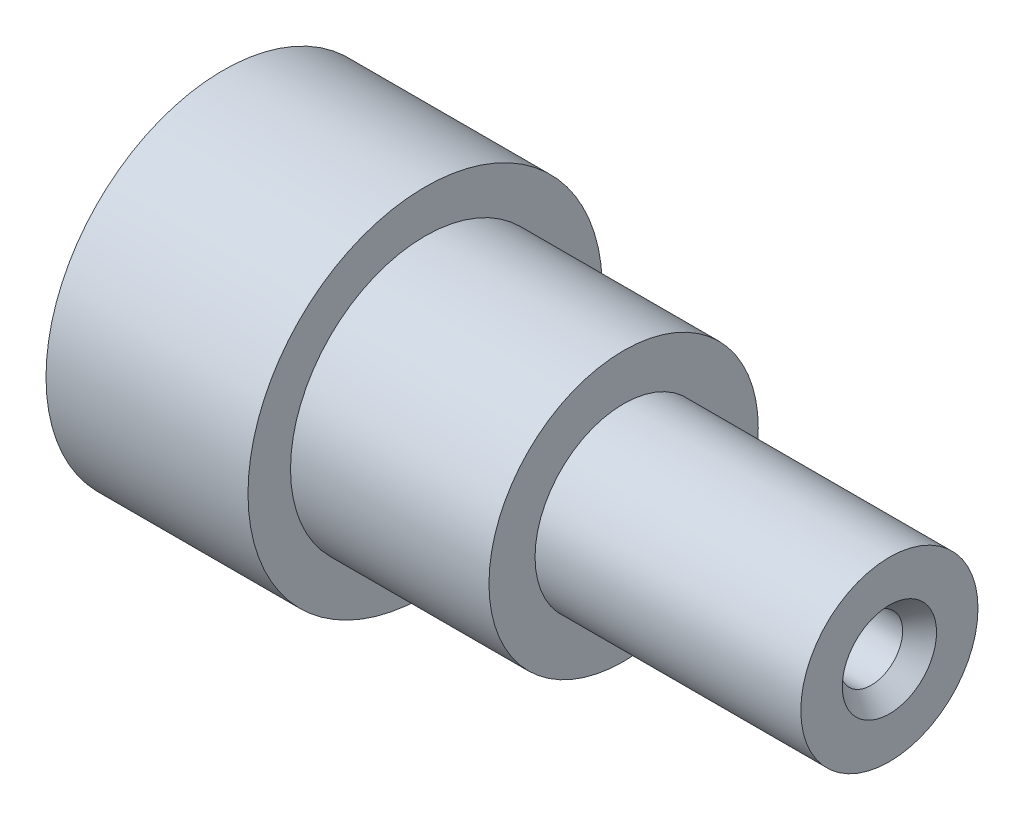
ISO-10303-21;
HEADER;
FILE_DESCRIPTION(('STEP AP214'),'2;1');
FILE_NAME('part.step','',(''),(''),'','','');
FILE_SCHEMA(('AUTOMOTIVE_DESIGN { 1 0 10303 214 1 1 1 1 }'));
ENDSEC;
DATA;
#1=APPLICATION_CONTEXT('core data for automotive mechanical design processes');
#2=APPLICATION_PROTOCOL_DEFINITION('international standard','automotive_design',2000,#1);
#3=PRODUCT_CONTEXT('',#1,'mechanical');
#4=PRODUCT('Part','Part','',(#3));
#5=PRODUCT_RELATED_PRODUCT_CATEGORY('part','',(#4));
#6=PRODUCT_DEFINITION_FORMATION('','',#4);
#7=PRODUCT_DEFINITION_CONTEXT('part definition',#1,'design');
#8=PRODUCT_DEFINITION('design','',#6,#7);
#9=PRODUCT_DEFINITION_SHAPE('','',#8);
#10=(LENGTH_UNIT() NAMED_UNIT(*) SI_UNIT(.MILLI.,.METRE.));
#11=(NAMED_UNIT(*) PLANE_ANGLE_UNIT() SI_UNIT($,.RADIAN.));
#12=(NAMED_UNIT(*) SI_UNIT($,.STERADIAN.) SOLID_ANGLE_UNIT());
#13=UNCERTAINTY_MEASURE_WITH_UNIT(LENGTH_MEASURE(1.E-05),#10,'distance_accuracy_value','');
#14=(GEOMETRIC_REPRESENTATION_CONTEXT(3) GLOBAL_UNCERTAINTY_ASSIGNED_CONTEXT((#13)) GLOBAL_UNIT_ASSIGNED_CONTEXT((#10,
#11,#12)) REPRESENTATION_CONTEXT('',''));
#15=CARTESIAN_POINT('',(0.,0.,0.));
#16=DIRECTION('',(0.,0.,1.));
#17=DIRECTION('',(1.,0.,0.));
#18=AXIS2_PLACEMENT_3D('',#15,#16,#17);
#19=CARTESIAN_POINT('',(-22.6005248359888,0.,-12.7));
#20=DIRECTION('',(1.,0.,0.));
#21=DIRECTION('',(0.,0.,-1.));
#22=AXIS2_PLACEMENT_3D('',#19,#20,#21);
#23=PLANE('',#22);
#24=CARTESIAN_POINT('',(-22.6005248359888,0.,0.));
#25=DIRECTION('',(-1.,0.,0.));
#26=DIRECTION('',(0.,0.,1.));
#27=AXIS2_PLACEMENT_3D('',#24,#25,#26);
#28=CIRCLE('',#27,12.7);
#29=CARTESIAN_POINT('',(-22.6005248359888,0.,12.7));
#30=VERTEX_POINT('',#29);
#31=EDGE_CURVE('E69',#30,#30,#28,.T.);
#32=ORIENTED_EDGE('',*,*,#31,.T.);
#33=EDGE_LOOP('',(#32));
#34=FACE_BOUND('',#33,.T.);
#35=ADVANCED_FACE('F47',(#34),#23,.F.);
#36=CARTESIAN_POINT('',(25.1514751640112,0.,0.));
#37=DIRECTION('',(-1.,0.,0.));
#38=DIRECTION('',(0.,0.,1.));
#39=AXIS2_PLACEMENT_3D('',#36,#37,#38);
#40=PLANE('',#39);
#41=CARTESIAN_POINT('',(25.1514751640112,0.,0.));
#42=DIRECTION('',(1.,0.,0.));
#43=DIRECTION('',(0.,0.,-1.));
#44=AXIS2_PLACEMENT_3D('',#41,#42,#43);
#45=CIRCLE('',#44,3.3782);
#46=CARTESIAN_POINT('',(25.1514751640112,0.,-3.3782));
#47=VERTEX_POINT('',#46);
#48=EDGE_CURVE('E78',#47,#47,#45,.T.);
#49=ORIENTED_EDGE('',*,*,#48,.F.);
#50=EDGE_LOOP('',(#49));
#51=FACE_BOUND('',#50,.T.);
#52=CARTESIAN_POINT('',(25.1514751640112,0.,0.));
#53=DIRECTION('',(-1.,0.,0.));
#54=DIRECTION('',(0.,0.,1.));
#55=AXIS2_PLACEMENT_3D('',#52,#53,#54);
#56=CIRCLE('',#55,6.35);
#57=CARTESIAN_POINT('',(25.1514751640112,0.,6.35));
#58=VERTEX_POINT('',#57);
#59=EDGE_CURVE('E11',#58,#58,#56,.T.);
#60=ORIENTED_EDGE('',*,*,#59,.F.);
#61=EDGE_LOOP('',(#60));
#62=FACE_BOUND('',#61,.T.);
#63=ADVANCED_FACE('F105',(#51,#62),#40,.F.);
#64=CARTESIAN_POINT('',(-22.6005248359888,0.,0.));
#65=DIRECTION('',(-1.,0.,0.));
#66=DIRECTION('',(0.,0.,1.));
#67=AXIS2_PLACEMENT_3D('',#64,#65,#66);
#68=CYLINDRICAL_SURFACE('',#67,6.35);
#69=CARTESIAN_POINT('',(6.10147516401124,0.,0.));
#70=DIRECTION('',(-1.,0.,0.));
#71=DIRECTION('',(0.,0.,1.));
#72=AXIS2_PLACEMENT_3D('',#69,#70,#71);
#73=CIRCLE('',#72,6.35);
#74=CARTESIAN_POINT('',(6.10147516401124,0.,6.35));
#75=VERTEX_POINT('',#74);
#76=EDGE_CURVE('E57',#75,#75,#73,.T.);
#77=ORIENTED_EDGE('',*,*,#76,.F.);
#78=EDGE_LOOP('',(#77));
#79=FACE_BOUND('',#78,.T.);
#80=ORIENTED_EDGE('',*,*,#59,.T.);
#81=EDGE_LOOP('',(#80));
#82=FACE_BOUND('',#81,.T.);
#83=ADVANCED_FACE('F97',(#79,#82),#68,.T.);
#84=CARTESIAN_POINT('',(6.10147516401124,0.,-6.35));
#85=DIRECTION('',(-1.,0.,0.));
#86=DIRECTION('',(0.,0.,1.));
#87=AXIS2_PLACEMENT_3D('',#84,#85,#86);
#88=PLANE('',#87);
#89=CARTESIAN_POINT('',(6.10147516401124,0.,0.));
#90=DIRECTION('',(-1.,0.,0.));
#91=DIRECTION('',(0.,0.,1.));
#92=AXIS2_PLACEMENT_3D('',#89,#90,#91);
#93=CIRCLE('',#92,9.652);
#94=CARTESIAN_POINT('',(6.10147516401124,0.,9.652));
#95=VERTEX_POINT('',#94);
#96=EDGE_CURVE('E89',#95,#95,#93,.T.);
#97=ORIENTED_EDGE('',*,*,#96,.F.);
#98=EDGE_LOOP('',(#97));
#99=FACE_BOUND('',#98,.T.);
#100=ORIENTED_EDGE('',*,*,#76,.T.);
#101=EDGE_LOOP('',(#100));
#102=FACE_BOUND('',#101,.T.);
#103=ADVANCED_FACE('F100',(#99,#102),#88,.F.);
#104=CARTESIAN_POINT('',(-22.6005248359888,0.,0.));
#105=DIRECTION('',(-1.,0.,0.));
#106=DIRECTION('',(0.,0.,1.));
#107=AXIS2_PLACEMENT_3D('',#104,#105,#106);
#108=CYLINDRICAL_SURFACE('',#107,9.652);
#109=CARTESIAN_POINT('',(-8.12252483598875,0.,0.));
#110=DIRECTION('',(-1.,0.,0.));
#111=DIRECTION('',(0.,0.,1.));
#112=AXIS2_PLACEMENT_3D('',#109,#110,#111);
#113=CIRCLE('',#112,9.652);
#114=CARTESIAN_POINT('',(-8.12252483598875,0.,9.652));
#115=VERTEX_POINT('',#114);
#116=EDGE_CURVE('E88',#115,#115,#113,.T.);
#117=ORIENTED_EDGE('',*,*,#116,.F.);
#118=EDGE_LOOP('',(#117));
#119=FACE_BOUND('',#118,.T.);
#120=ORIENTED_EDGE('',*,*,#96,.T.);
#121=EDGE_LOOP('',(#120));
#122=FACE_BOUND('',#121,.T.);
#123=ADVANCED_FACE('F120',(#119,#122),#108,.T.);
#124=CARTESIAN_POINT('',(-8.12252483598875,0.,-9.652));
#125=DIRECTION('',(-1.,0.,0.));
#126=DIRECTION('',(0.,0.,1.));
#127=AXIS2_PLACEMENT_3D('',#124,#125,#126);
#128=PLANE('',#127);
#129=CARTESIAN_POINT('',(-8.12252483598875,0.,0.));
#130=DIRECTION('',(-1.,0.,0.));
#131=DIRECTION('',(0.,0.,1.));
#132=AXIS2_PLACEMENT_3D('',#129,#130,#131);
#133=CIRCLE('',#132,12.7);
#134=CARTESIAN_POINT('',(-8.12252483598875,0.,12.7));
#135=VERTEX_POINT('',#134);
#136=EDGE_CURVE('E76',#135,#135,#133,.T.);
#137=ORIENTED_EDGE('',*,*,#136,.F.);
#138=EDGE_LOOP('',(#137));
#139=FACE_BOUND('',#138,.T.);
#140=ORIENTED_EDGE('',*,*,#116,.T.);
#141=EDGE_LOOP('',(#140));
#142=FACE_BOUND('',#141,.T.);
#143=ADVANCED_FACE('F121',(#139,#142),#128,.F.);
#144=CARTESIAN_POINT('',(-22.6005248359888,0.,0.));
#145=DIRECTION('',(-1.,0.,0.));
#146=DIRECTION('',(0.,0.,1.));
#147=AXIS2_PLACEMENT_3D('',#144,#145,#146);
#148=CYLINDRICAL_SURFACE('',#147,12.7);
#149=ORIENTED_EDGE('',*,*,#31,.F.);
#150=EDGE_LOOP('',(#149));
#151=FACE_BOUND('',#150,.T.);
#152=ORIENTED_EDGE('',*,*,#136,.T.);
#153=EDGE_LOOP('',(#152));
#154=FACE_BOUND('',#153,.T.);
#155=ADVANCED_FACE('F62',(#151,#154),#148,.T.);
#156=CARTESIAN_POINT('',(6.10147516401125,0.,0.));
#157=DIRECTION('',(1.,0.,0.));
#158=DIRECTION('',(0.,0.,-1.));
#159=AXIS2_PLACEMENT_3D('',#156,#157,#158);
#160=CONICAL_SURFACE('',#159,2.2479,1.02974425867665);
#161=CARTESIAN_POINT('',(4.75080057849919,0.,0.));
#162=VERTEX_POINT('',#161);
#163=VERTEX_LOOP('',#162);
#164=FACE_BOUND('',#163,.T.);
#165=CARTESIAN_POINT('',(6.10147516401125,0.,0.));
#166=DIRECTION('',(1.,0.,0.));
#167=DIRECTION('',(0.,0.,-1.));
#168=AXIS2_PLACEMENT_3D('',#165,#166,#167);
#169=CIRCLE('',#168,2.2479);
#170=CARTESIAN_POINT('',(6.10147516401125,0.,-2.2479));
#171=VERTEX_POINT('',#170);
#172=EDGE_CURVE('E70',#171,#171,#169,.T.);
#173=ORIENTED_EDGE('',*,*,#172,.T.);
#174=EDGE_LOOP('',(#173));
#175=FACE_BOUND('',#174,.T.);
#176=ADVANCED_FACE('F56',(#164,#175),#160,.F.);
#177=CARTESIAN_POINT('',(25.1514751640112,0.,0.));
#178=DIRECTION('',(1.,0.,0.));
#179=DIRECTION('',(0.,0.,-1.));
#180=AXIS2_PLACEMENT_3D('',#177,#178,#179);
#181=CYLINDRICAL_SURFACE('',#180,2.2479);
#182=ORIENTED_EDGE('',*,*,#172,.F.);
#183=EDGE_LOOP('',(#182));
#184=FACE_BOUND('',#183,.T.);
#185=CARTESIAN_POINT('',(23.8512137533293,0.,0.));
#186=DIRECTION('',(1.,0.,0.));
#187=DIRECTION('',(0.,0.,-1.));
#188=AXIS2_PLACEMENT_3D('',#185,#186,#187);
#189=CIRCLE('',#188,2.2479);
#190=CARTESIAN_POINT('',(23.8512137533293,0.,-2.2479));
#191=VERTEX_POINT('',#190);
#192=EDGE_CURVE('E72',#191,#191,#189,.T.);
#193=ORIENTED_EDGE('',*,*,#192,.T.);
#194=EDGE_LOOP('',(#193));
#195=FACE_BOUND('',#194,.T.);
#196=ADVANCED_FACE('F65',(#184,#195),#181,.F.);
#197=CARTESIAN_POINT('',(25.1514751640112,0.,0.));
#198=DIRECTION('',(1.,0.,0.));
#199=DIRECTION('',(0.,0.,-1.));
#200=AXIS2_PLACEMENT_3D('',#197,#198,#199);
#201=CONICAL_SURFACE('',#200,3.3782,0.715584993317675);
#202=ORIENTED_EDGE('',*,*,#192,.F.);
#203=EDGE_LOOP('',(#202));
#204=FACE_BOUND('',#203,.T.);
#205=ORIENTED_EDGE('',*,*,#48,.T.);
#206=EDGE_LOOP('',(#205));
#207=FACE_BOUND('',#206,.T.);
#208=ADVANCED_FACE('F131',(#204,#207),#201,.F.);
#209=CLOSED_SHELL('',(#35,#63,#83,#103,#123,#143,#155,#176,#196,#208));
#210=MANIFOLD_SOLID_BREP('B2',#209);
#211=ADVANCED_BREP_SHAPE_REPRESENTATION('',(#18,#210),#14);
#212=SHAPE_DEFINITION_REPRESENTATION(#9,#211);
ENDSEC;
END-ISO-10303-21;
